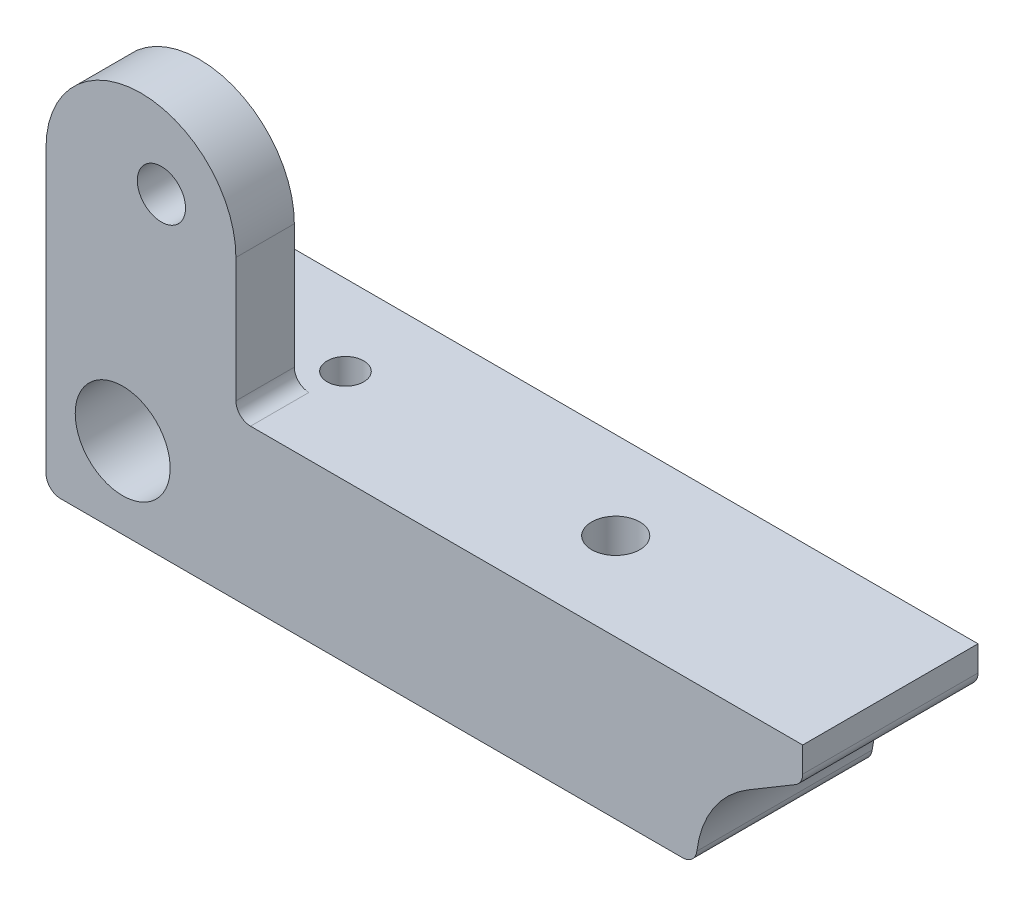
ISO-10303-21;
HEADER;
FILE_DESCRIPTION(('STEP AP214'),'2;1');
FILE_NAME('part.step','',(''),(''),'','','');
FILE_SCHEMA(('AUTOMOTIVE_DESIGN { 1 0 10303 214 1 1 1 1 }'));
ENDSEC;
DATA;
#1=APPLICATION_CONTEXT('core data for automotive mechanical design processes');
#2=APPLICATION_PROTOCOL_DEFINITION('international standard','automotive_design',2000,#1);
#3=PRODUCT_CONTEXT('',#1,'mechanical');
#4=PRODUCT('Part','Part','',(#3));
#5=PRODUCT_RELATED_PRODUCT_CATEGORY('part','',(#4));
#6=PRODUCT_DEFINITION_FORMATION('','',#4);
#7=PRODUCT_DEFINITION_CONTEXT('part definition',#1,'design');
#8=PRODUCT_DEFINITION('design','',#6,#7);
#9=PRODUCT_DEFINITION_SHAPE('','',#8);
#10=(LENGTH_UNIT() NAMED_UNIT(*) SI_UNIT(.MILLI.,.METRE.));
#11=(NAMED_UNIT(*) PLANE_ANGLE_UNIT() SI_UNIT($,.RADIAN.));
#12=(NAMED_UNIT(*) SI_UNIT($,.STERADIAN.) SOLID_ANGLE_UNIT());
#13=UNCERTAINTY_MEASURE_WITH_UNIT(LENGTH_MEASURE(1.E-05),#10,'distance_accuracy_value','');
#14=(GEOMETRIC_REPRESENTATION_CONTEXT(3) GLOBAL_UNCERTAINTY_ASSIGNED_CONTEXT((#13)) GLOBAL_UNIT_ASSIGNED_CONTEXT((#10,
#11,#12)) REPRESENTATION_CONTEXT('',''));
#15=CARTESIAN_POINT('',(0.,0.,0.));
#16=DIRECTION('',(0.,0.,1.));
#17=DIRECTION('',(1.,0.,0.));
#18=AXIS2_PLACEMENT_3D('',#15,#16,#17);
#19=CARTESIAN_POINT('',(-20.65,0.150000000000002,12.));
#20=DIRECTION('',(0.,0.,-1.));
#21=DIRECTION('',(-1.,0.,0.));
#22=AXIS2_PLACEMENT_3D('',#19,#20,#21);
#23=CYLINDRICAL_SURFACE('',#22,3.25);
#24=CARTESIAN_POINT('',(-20.65,0.150000000000002,12.));
#25=DIRECTION('',(0.,0.,-1.));
#26=DIRECTION('',(-1.,0.,0.));
#27=AXIS2_PLACEMENT_3D('',#24,#25,#26);
#28=CIRCLE('',#27,3.25);
#29=CARTESIAN_POINT('',(-23.9,0.150000000000002,12.));
#30=VERTEX_POINT('',#29);
#31=EDGE_CURVE('E168',#30,#30,#28,.T.);
#32=ORIENTED_EDGE('',*,*,#31,.F.);
#33=EDGE_LOOP('',(#32));
#34=FACE_BOUND('',#33,.T.);
#35=CARTESIAN_POINT('',(-20.65,0.150000000000002,1.05));
#36=DIRECTION('',(0.,0.,-1.));
#37=DIRECTION('',(-1.,0.,0.));
#38=AXIS2_PLACEMENT_3D('',#35,#36,#37);
#39=CIRCLE('',#38,3.25);
#40=CARTESIAN_POINT('',(-23.9,0.150000000000002,1.05));
#41=VERTEX_POINT('',#40);
#42=EDGE_CURVE('E38',#41,#41,#39,.F.);
#43=ORIENTED_EDGE('',*,*,#42,.F.);
#44=EDGE_LOOP('',(#43));
#45=FACE_BOUND('',#44,.T.);
#46=ADVANCED_FACE('F34',(#34,#45),#23,.F.);
#47=CARTESIAN_POINT('',(25.9,5.4,12.));
#48=DIRECTION('',(-1.,0.,0.));
#49=DIRECTION('',(0.,0.,1.));
#50=AXIS2_PLACEMENT_3D('',#47,#48,#49);
#51=PLANE('',#50);
#52=DIRECTION('',(0.,1.,0.));
#53=VECTOR('',#52,1.);
#54=CARTESIAN_POINT('',(25.9,5.4,12.));
#55=LINE('',#54,#53);
#56=CARTESIAN_POINT('',(25.9,3.66790298473761,12.));
#57=VERTEX_POINT('',#56);
#58=CARTESIAN_POINT('',(25.9,5.4,12.));
#59=VERTEX_POINT('',#58);
#60=EDGE_CURVE('E189',#57,#59,#55,.T.);
#61=ORIENTED_EDGE('',*,*,#60,.F.);
#62=DIRECTION('',(0.,0.,-1.));
#63=VECTOR('',#62,1.);
#64=CARTESIAN_POINT('',(25.9,3.66790298473761,12.));
#65=LINE('',#64,#63);
#66=CARTESIAN_POINT('',(25.9,3.66790298473761,0.));
#67=VERTEX_POINT('',#66);
#68=EDGE_CURVE('E212',#57,#67,#65,.T.);
#69=ORIENTED_EDGE('',*,*,#68,.T.);
#70=DIRECTION('',(0.,1.,0.));
#71=VECTOR('',#70,1.);
#72=CARTESIAN_POINT('',(25.9,5.4,0.));
#73=LINE('',#72,#71);
#74=CARTESIAN_POINT('',(25.9,5.4,0.));
#75=VERTEX_POINT('',#74);
#76=EDGE_CURVE('E186',#67,#75,#73,.T.);
#77=ORIENTED_EDGE('',*,*,#76,.T.);
#78=DIRECTION('',(0.,0.,-1.));
#79=VECTOR('',#78,1.);
#80=CARTESIAN_POINT('',(25.9,5.4,12.));
#81=LINE('',#80,#79);
#82=EDGE_CURVE('E200',#59,#75,#81,.T.);
#83=ORIENTED_EDGE('',*,*,#82,.F.);
#84=EDGE_LOOP('',(#61,#69,#77,#83));
#85=FACE_BOUND('',#84,.T.);
#86=ADVANCED_FACE('F265',(#85),#51,.F.);
#87=CARTESIAN_POINT('',(-25.9,5.4,12.));
#88=DIRECTION('',(0.,-1.,0.));
#89=DIRECTION('',(0.,0.,-1.));
#90=AXIS2_PLACEMENT_3D('',#87,#88,#89);
#91=PLANE('',#90);
#92=CARTESIAN_POINT('',(-11.9,5.4,5.5));
#93=DIRECTION('',(0.,1.,0.));
#94=DIRECTION('',(0.,0.,1.));
#95=AXIS2_PLACEMENT_3D('',#92,#93,#94);
#96=CIRCLE('',#95,1.25);
#97=CARTESIAN_POINT('',(-11.9,5.4,6.75));
#98=VERTEX_POINT('',#97);
#99=EDGE_CURVE('E344',#98,#98,#96,.T.);
#100=ORIENTED_EDGE('',*,*,#99,.F.);
#101=EDGE_LOOP('',(#100));
#102=FACE_BOUND('',#101,.T.);
#103=CARTESIAN_POINT('',(7.09999999999999,5.4,6.));
#104=DIRECTION('',(0.,1.,0.));
#105=DIRECTION('',(0.,0.,1.));
#106=AXIS2_PLACEMENT_3D('',#103,#104,#105);
#107=CIRCLE('',#106,1.65);
#108=CARTESIAN_POINT('',(7.09999999999999,5.4,7.65));
#109=VERTEX_POINT('',#108);
#110=EDGE_CURVE('E347',#109,#109,#107,.T.);
#111=ORIENTED_EDGE('',*,*,#110,.F.);
#112=EDGE_LOOP('',(#111));
#113=FACE_BOUND('',#112,.T.);
#114=DIRECTION('',(1.,0.,0.));
#115=VECTOR('',#114,1.);
#116=CARTESIAN_POINT('',(-25.9,5.4,8.));
#117=LINE('',#116,#115);
#118=CARTESIAN_POINT('',(-24.9,5.4,8.));
#119=VERTEX_POINT('',#118);
#120=CARTESIAN_POINT('',(-11.9,5.4,8.));
#121=VERTEX_POINT('',#120);
#122=EDGE_CURVE('E177',#119,#121,#117,.T.);
#123=ORIENTED_EDGE('',*,*,#122,.T.);
#124=DIRECTION('',(0.,0.,1.));
#125=VECTOR('',#124,1.);
#126=CARTESIAN_POINT('',(-11.9,5.4,12.));
#127=LINE('',#126,#125);
#128=CARTESIAN_POINT('',(-11.9,5.4,12.));
#129=VERTEX_POINT('',#128);
#130=EDGE_CURVE('E238',#121,#129,#127,.T.);
#131=ORIENTED_EDGE('',*,*,#130,.T.);
#132=DIRECTION('',(-1.,0.,0.));
#133=VECTOR('',#132,1.);
#134=CARTESIAN_POINT('',(-25.9,5.4,12.));
#135=LINE('',#134,#133);
#136=EDGE_CURVE('E191',#59,#129,#135,.T.);
#137=ORIENTED_EDGE('',*,*,#136,.F.);
#138=ORIENTED_EDGE('',*,*,#82,.T.);
#139=DIRECTION('',(-1.,0.,0.));
#140=VECTOR('',#139,1.);
#141=CARTESIAN_POINT('',(-25.9,5.4,0.));
#142=LINE('',#141,#140);
#143=CARTESIAN_POINT('',(-24.9,5.4,0.));
#144=VERTEX_POINT('',#143);
#145=EDGE_CURVE('E202',#75,#144,#142,.T.);
#146=ORIENTED_EDGE('',*,*,#145,.T.);
#147=DIRECTION('',(0.,0.,-1.));
#148=VECTOR('',#147,1.);
#149=CARTESIAN_POINT('',(-24.9,5.4,12.));
#150=LINE('',#149,#148);
#151=EDGE_CURVE('E236',#144,#119,#150,.F.);
#152=ORIENTED_EDGE('',*,*,#151,.T.);
#153=EDGE_LOOP('',(#123,#131,#137,#138,#146,#152));
#154=FACE_BOUND('',#153,.T.);
#155=ADVANCED_FACE('F260',(#102,#113,#154),#91,.F.);
#156=CARTESIAN_POINT('',(-25.9,5.4,12.));
#157=DIRECTION('',(1.,0.,0.));
#158=DIRECTION('',(0.,0.,-1.));
#159=AXIS2_PLACEMENT_3D('',#156,#157,#158);
#160=PLANE('',#159);
#161=DIRECTION('',(0.,-1.,0.));
#162=VECTOR('',#161,1.);
#163=CARTESIAN_POINT('',(-25.9,14.9,8.));
#164=LINE('',#163,#162);
#165=CARTESIAN_POINT('',(-25.9,14.9,8.));
#166=VERTEX_POINT('',#165);
#167=CARTESIAN_POINT('',(-25.9,4.4,8.));
#168=VERTEX_POINT('',#167);
#169=EDGE_CURVE('E50',#166,#168,#164,.T.);
#170=ORIENTED_EDGE('',*,*,#169,.T.);
#171=DIRECTION('',(0.,0.,-1.));
#172=VECTOR('',#171,1.);
#173=CARTESIAN_POINT('',(-25.9,4.4,12.));
#174=LINE('',#173,#172);
#175=CARTESIAN_POINT('',(-25.9,4.4,0.));
#176=VERTEX_POINT('',#175);
#177=EDGE_CURVE('E244',#168,#176,#174,.T.);
#178=ORIENTED_EDGE('',*,*,#177,.T.);
#179=DIRECTION('',(0.,-1.,0.));
#180=VECTOR('',#179,1.);
#181=CARTESIAN_POINT('',(-25.9,5.4,0.));
#182=LINE('',#181,#180);
#183=CARTESIAN_POINT('',(-25.9,-4.39999999999999,0.));
#184=VERTEX_POINT('',#183);
#185=EDGE_CURVE('E205',#176,#184,#182,.T.);
#186=ORIENTED_EDGE('',*,*,#185,.T.);
#187=DIRECTION('',(0.,0.,-1.));
#188=VECTOR('',#187,1.);
#189=CARTESIAN_POINT('',(-25.9,-4.4,12.));
#190=LINE('',#189,#188);
#191=CARTESIAN_POINT('',(-25.9,-4.39999999999999,12.));
#192=VERTEX_POINT('',#191);
#193=EDGE_CURVE('E242',#184,#192,#190,.F.);
#194=ORIENTED_EDGE('',*,*,#193,.T.);
#195=DIRECTION('',(0.,-1.,0.));
#196=VECTOR('',#195,1.);
#197=CARTESIAN_POINT('',(-25.9,5.4,12.));
#198=LINE('',#197,#196);
#199=CARTESIAN_POINT('',(-25.9,14.9,12.));
#200=VERTEX_POINT('',#199);
#201=EDGE_CURVE('E195',#200,#192,#198,.T.);
#202=ORIENTED_EDGE('',*,*,#201,.F.);
#203=DIRECTION('',(0.,0.,1.));
#204=VECTOR('',#203,1.);
#205=CARTESIAN_POINT('',(-25.9,14.9,8.));
#206=LINE('',#205,#204);
#207=EDGE_CURVE('E183',#166,#200,#206,.T.);
#208=ORIENTED_EDGE('',*,*,#207,.F.);
#209=EDGE_LOOP('',(#170,#178,#186,#194,#202,#208));
#210=FACE_BOUND('',#209,.T.);
#211=ADVANCED_FACE('F333',(#210),#160,.F.);
#212=CARTESIAN_POINT('',(-25.9,-5.4,12.));
#213=DIRECTION('',(0.,1.,0.));
#214=DIRECTION('',(0.,0.,1.));
#215=AXIS2_PLACEMENT_3D('',#212,#213,#214);
#216=PLANE('',#215);
#217=CARTESIAN_POINT('',(-11.9,-5.4,5.5));
#218=DIRECTION('',(0.,1.,0.));
#219=DIRECTION('',(0.,0.,1.));
#220=AXIS2_PLACEMENT_3D('',#217,#218,#219);
#221=CIRCLE('',#220,1.25);
#222=CARTESIAN_POINT('',(-11.9,-5.4,6.75));
#223=VERTEX_POINT('',#222);
#224=EDGE_CURVE('E350',#223,#223,#221,.T.);
#225=ORIENTED_EDGE('',*,*,#224,.T.);
#226=EDGE_LOOP('',(#225));
#227=FACE_BOUND('',#226,.T.);
#228=CARTESIAN_POINT('',(7.09999999999999,-5.4,6.));
#229=DIRECTION('',(0.,1.,0.));
#230=DIRECTION('',(0.,0.,1.));
#231=AXIS2_PLACEMENT_3D('',#228,#229,#230);
#232=CIRCLE('',#231,1.65);
#233=CARTESIAN_POINT('',(7.09999999999999,-5.4,7.65));
#234=VERTEX_POINT('',#233);
#235=EDGE_CURVE('E349',#234,#234,#232,.T.);
#236=ORIENTED_EDGE('',*,*,#235,.T.);
#237=EDGE_LOOP('',(#236));
#238=FACE_BOUND('',#237,.T.);
#239=DIRECTION('',(1.,0.,0.));
#240=VECTOR('',#239,1.);
#241=CARTESIAN_POINT('',(-25.9,-5.4,0.));
#242=LINE('',#241,#240);
#243=CARTESIAN_POINT('',(-24.9,-5.4,0.));
#244=VERTEX_POINT('',#243);
#245=CARTESIAN_POINT('',(17.6604611779542,-5.4,0.));
#246=VERTEX_POINT('',#245);
#247=EDGE_CURVE('E192',#244,#246,#242,.T.);
#248=ORIENTED_EDGE('',*,*,#247,.T.);
#249=DIRECTION('',(0.,0.,-1.));
#250=VECTOR('',#249,1.);
#251=CARTESIAN_POINT('',(17.6604611779542,-5.4,12.));
#252=LINE('',#251,#250);
#253=CARTESIAN_POINT('',(17.6604611779542,-5.4,12.));
#254=VERTEX_POINT('',#253);
#255=EDGE_CURVE('E234',#246,#254,#252,.F.);
#256=ORIENTED_EDGE('',*,*,#255,.T.);
#257=DIRECTION('',(1.,0.,0.));
#258=VECTOR('',#257,1.);
#259=CARTESIAN_POINT('',(-25.9,-5.4,12.));
#260=LINE('',#259,#258);
#261=CARTESIAN_POINT('',(-24.9,-5.4,12.));
#262=VERTEX_POINT('',#261);
#263=EDGE_CURVE('E198',#262,#254,#260,.T.);
#264=ORIENTED_EDGE('',*,*,#263,.F.);
#265=DIRECTION('',(0.,0.,-1.));
#266=VECTOR('',#265,1.);
#267=CARTESIAN_POINT('',(-24.9,-5.4,12.));
#268=LINE('',#267,#266);
#269=EDGE_CURVE('E231',#262,#244,#268,.T.);
#270=ORIENTED_EDGE('',*,*,#269,.T.);
#271=EDGE_LOOP('',(#248,#256,#264,#270));
#272=FACE_BOUND('',#271,.T.);
#273=ADVANCED_FACE('F289',(#227,#238,#272),#216,.F.);
#274=CARTESIAN_POINT('',(0.,0.,12.));
#275=DIRECTION('',(0.,0.,1.));
#276=DIRECTION('',(1.,0.,0.));
#277=AXIS2_PLACEMENT_3D('',#274,#275,#276);
#278=PLANE('',#277);
#279=CARTESIAN_POINT('',(-18.,16.1,12.));
#280=DIRECTION('',(0.,0.,1.));
#281=DIRECTION('',(1.,0.,0.));
#282=AXIS2_PLACEMENT_3D('',#279,#280,#281);
#283=CIRCLE('',#282,1.64999999999999);
#284=CARTESIAN_POINT('',(-16.35,16.1,12.));
#285=VERTEX_POINT('',#284);
#286=EDGE_CURVE('E396',#285,#285,#283,.T.);
#287=ORIENTED_EDGE('',*,*,#286,.F.);
#288=EDGE_LOOP('',(#287));
#289=FACE_BOUND('',#288,.T.);
#290=ORIENTED_EDGE('',*,*,#31,.T.);
#291=EDGE_LOOP('',(#290));
#292=FACE_BOUND('',#291,.T.);
#293=DIRECTION('',(0.858823529411765,0.51227155428417,0.));
#294=VECTOR('',#293,1.);
#295=CARTESIAN_POINT('',(22.1604176537255,0.869411764705884,12.));
#296=LINE('',#295,#294);
#297=CARTESIAN_POINT('',(22.1604176537255,0.869411764705884,12.));
#298=VERTEX_POINT('',#297);
#299=CARTESIAN_POINT('',(25.4122715542842,2.80907945532585,12.));
#300=VERTEX_POINT('',#299);
#301=EDGE_CURVE('E141',#298,#300,#296,.T.);
#302=ORIENTED_EDGE('',*,*,#301,.T.);
#303=CARTESIAN_POINT('',(24.9,3.66790298473761,12.));
#304=DIRECTION('',(0.,0.,1.));
#305=DIRECTION('',(1.,0.,0.));
#306=AXIS2_PLACEMENT_3D('',#303,#304,#305);
#307=CIRCLE('',#306,1.);
#308=EDGE_CURVE('E227',#300,#57,#307,.T.);
#309=ORIENTED_EDGE('',*,*,#308,.T.);
#310=ORIENTED_EDGE('',*,*,#60,.T.);
#311=ORIENTED_EDGE('',*,*,#136,.T.);
#312=CARTESIAN_POINT('',(-11.9,6.4,12.));
#313=DIRECTION('',(0.,0.,1.));
#314=DIRECTION('',(1.,0.,0.));
#315=AXIS2_PLACEMENT_3D('',#312,#313,#314);
#316=CIRCLE('',#315,1.);
#317=CARTESIAN_POINT('',(-12.9,6.4,12.));
#318=VERTEX_POINT('',#317);
#319=EDGE_CURVE('E246',#129,#318,#316,.F.);
#320=ORIENTED_EDGE('',*,*,#319,.T.);
#321=DIRECTION('',(0.,1.,0.));
#322=VECTOR('',#321,1.);
#323=CARTESIAN_POINT('',(-12.9,5.4,12.));
#324=LINE('',#323,#322);
#325=CARTESIAN_POINT('',(-12.9,14.9,12.));
#326=VERTEX_POINT('',#325);
#327=EDGE_CURVE('E159',#318,#326,#324,.T.);
#328=ORIENTED_EDGE('',*,*,#327,.T.);
#329=CARTESIAN_POINT('',(-19.4,14.9,12.));
#330=DIRECTION('',(0.,0.,1.));
#331=DIRECTION('',(1.,0.,0.));
#332=AXIS2_PLACEMENT_3D('',#329,#330,#331);
#333=CIRCLE('',#332,6.5);
#334=EDGE_CURVE('E173',#326,#200,#333,.T.);
#335=ORIENTED_EDGE('',*,*,#334,.T.);
#336=ORIENTED_EDGE('',*,*,#201,.T.);
#337=CARTESIAN_POINT('',(-24.9,-4.4,12.));
#338=DIRECTION('',(0.,0.,1.));
#339=DIRECTION('',(1.,0.,0.));
#340=AXIS2_PLACEMENT_3D('',#337,#338,#339);
#341=CIRCLE('',#340,1.);
#342=EDGE_CURVE('E224',#192,#262,#341,.T.);
#343=ORIENTED_EDGE('',*,*,#342,.T.);
#344=ORIENTED_EDGE('',*,*,#263,.T.);
#345=CARTESIAN_POINT('',(17.6604611779542,-4.4,12.));
#346=DIRECTION('',(0.,0.,1.));
#347=DIRECTION('',(1.,0.,0.));
#348=AXIS2_PLACEMENT_3D('',#345,#346,#347);
#349=CIRCLE('',#348,1.);
#350=CARTESIAN_POINT('',(18.6531766986826,-4.52048192771084,12.));
#351=VERTEX_POINT('',#350);
#352=EDGE_CURVE('E145',#254,#351,#349,.T.);
#353=ORIENTED_EDGE('',*,*,#352,.T.);
#354=CARTESIAN_POINT('',(25.9,-5.4,12.));
#355=DIRECTION('',(0.,0.,-1.));
#356=DIRECTION('',(1.,0.,0.));
#357=AXIS2_PLACEMENT_3D('',#354,#355,#356);
#358=CIRCLE('',#357,7.3);
#359=EDGE_CURVE('E137',#351,#298,#358,.T.);
#360=ORIENTED_EDGE('',*,*,#359,.T.);
#361=EDGE_LOOP('',(#302,#309,#310,#311,#320,#328,#335,#336,#343,#344,#353,#360));
#362=FACE_BOUND('',#361,.T.);
#363=ADVANCED_FACE('F139',(#289,#292,#362),#278,.T.);
#364=CARTESIAN_POINT('',(0.,0.,0.));
#365=DIRECTION('',(0.,0.,1.));
#366=DIRECTION('',(1.,0.,0.));
#367=AXIS2_PLACEMENT_3D('',#364,#365,#366);
#368=PLANE('',#367);
#369=CARTESIAN_POINT('',(-20.65,0.150000000000002,0.));
#370=DIRECTION('',(0.,0.,-1.));
#371=DIRECTION('',(-1.,0.,0.));
#372=AXIS2_PLACEMENT_3D('',#369,#370,#371);
#373=CIRCLE('',#372,4.);
#374=CARTESIAN_POINT('',(-24.65,0.150000000000002,0.));
#375=VERTEX_POINT('',#374);
#376=EDGE_CURVE('E353',#375,#375,#373,.T.);
#377=ORIENTED_EDGE('',*,*,#376,.F.);
#378=EDGE_LOOP('',(#377));
#379=FACE_BOUND('',#378,.T.);
#380=ORIENTED_EDGE('',*,*,#76,.F.);
#381=CARTESIAN_POINT('',(24.9,3.66790298473761,0.));
#382=DIRECTION('',(0.,0.,1.));
#383=DIRECTION('',(1.,0.,0.));
#384=AXIS2_PLACEMENT_3D('',#381,#382,#383);
#385=CIRCLE('',#384,1.);
#386=CARTESIAN_POINT('',(25.4122715542842,2.80907945532585,0.));
#387=VERTEX_POINT('',#386);
#388=EDGE_CURVE('E221',#67,#387,#385,.F.);
#389=ORIENTED_EDGE('',*,*,#388,.T.);
#390=DIRECTION('',(0.858823529411765,0.51227155428417,0.));
#391=VECTOR('',#390,1.);
#392=CARTESIAN_POINT('',(22.1604176537255,0.869411764705884,0.));
#393=LINE('',#392,#391);
#394=CARTESIAN_POINT('',(22.1604176537255,0.869411764705884,0.));
#395=VERTEX_POINT('',#394);
#396=EDGE_CURVE('E149',#395,#387,#393,.T.);
#397=ORIENTED_EDGE('',*,*,#396,.F.);
#398=CARTESIAN_POINT('',(25.9,-5.4,0.));
#399=DIRECTION('',(0.,0.,-1.));
#400=DIRECTION('',(1.,0.,0.));
#401=AXIS2_PLACEMENT_3D('',#398,#399,#400);
#402=CIRCLE('',#401,7.3);
#403=CARTESIAN_POINT('',(18.6531766986826,-4.52048192771084,0.));
#404=VERTEX_POINT('',#403);
#405=EDGE_CURVE('E155',#404,#395,#402,.T.);
#406=ORIENTED_EDGE('',*,*,#405,.F.);
#407=CARTESIAN_POINT('',(17.6604611779542,-4.4,0.));
#408=DIRECTION('',(0.,0.,1.));
#409=DIRECTION('',(1.,0.,0.));
#410=AXIS2_PLACEMENT_3D('',#407,#408,#409);
#411=CIRCLE('',#410,1.);
#412=EDGE_CURVE('E219',#404,#246,#411,.F.);
#413=ORIENTED_EDGE('',*,*,#412,.T.);
#414=ORIENTED_EDGE('',*,*,#247,.F.);
#415=CARTESIAN_POINT('',(-24.9,-4.4,0.));
#416=DIRECTION('',(0.,0.,1.));
#417=DIRECTION('',(1.,0.,0.));
#418=AXIS2_PLACEMENT_3D('',#415,#416,#417);
#419=CIRCLE('',#418,1.);
#420=EDGE_CURVE('E215',#244,#184,#419,.F.);
#421=ORIENTED_EDGE('',*,*,#420,.T.);
#422=ORIENTED_EDGE('',*,*,#185,.F.);
#423=CARTESIAN_POINT('',(-24.9,4.4,0.));
#424=DIRECTION('',(0.,0.,1.));
#425=DIRECTION('',(1.,0.,0.));
#426=AXIS2_PLACEMENT_3D('',#423,#424,#425);
#427=CIRCLE('',#426,1.);
#428=EDGE_CURVE('E217',#176,#144,#427,.F.);
#429=ORIENTED_EDGE('',*,*,#428,.T.);
#430=ORIENTED_EDGE('',*,*,#145,.F.);
#431=EDGE_LOOP('',(#380,#389,#397,#406,#413,#414,#421,#422,#429,#430));
#432=FACE_BOUND('',#431,.T.);
#433=ADVANCED_FACE('F270',(#379,#432),#368,.F.);
#434=CARTESIAN_POINT('',(-12.9,5.4,8.));
#435=DIRECTION('',(1.,0.,0.));
#436=DIRECTION('',(0.,1.,0.));
#437=AXIS2_PLACEMENT_3D('',#434,#435,#436);
#438=PLANE('',#437);
#439=ORIENTED_EDGE('',*,*,#327,.F.);
#440=DIRECTION('',(0.,0.,1.));
#441=VECTOR('',#440,1.);
#442=CARTESIAN_POINT('',(-12.9,6.4,8.));
#443=LINE('',#442,#441);
#444=CARTESIAN_POINT('',(-12.9,6.4,8.));
#445=VERTEX_POINT('',#444);
#446=EDGE_CURVE('E57',#318,#445,#443,.F.);
#447=ORIENTED_EDGE('',*,*,#446,.T.);
#448=DIRECTION('',(0.,1.,0.));
#449=VECTOR('',#448,1.);
#450=CARTESIAN_POINT('',(-12.9,5.4,8.));
#451=LINE('',#450,#449);
#452=CARTESIAN_POINT('',(-12.9,14.9,8.));
#453=VERTEX_POINT('',#452);
#454=EDGE_CURVE('E170',#445,#453,#451,.T.);
#455=ORIENTED_EDGE('',*,*,#454,.T.);
#456=DIRECTION('',(0.,0.,1.));
#457=VECTOR('',#456,1.);
#458=CARTESIAN_POINT('',(-12.9,14.9,8.));
#459=LINE('',#458,#457);
#460=EDGE_CURVE('E179',#453,#326,#459,.T.);
#461=ORIENTED_EDGE('',*,*,#460,.T.);
#462=EDGE_LOOP('',(#439,#447,#455,#461));
#463=FACE_BOUND('',#462,.T.);
#464=ADVANCED_FACE('F281',(#463),#438,.T.);
#465=CARTESIAN_POINT('',(-19.4,14.9,8.));
#466=DIRECTION('',(0.,0.,1.));
#467=DIRECTION('',(1.,0.,0.));
#468=AXIS2_PLACEMENT_3D('',#465,#466,#467);
#469=CYLINDRICAL_SURFACE('',#468,6.5);
#470=ORIENTED_EDGE('',*,*,#334,.F.);
#471=ORIENTED_EDGE('',*,*,#460,.F.);
#472=CARTESIAN_POINT('',(-19.4,14.9,8.));
#473=DIRECTION('',(0.,0.,1.));
#474=DIRECTION('',(1.,0.,0.));
#475=AXIS2_PLACEMENT_3D('',#472,#473,#474);
#476=CIRCLE('',#475,6.5);
#477=EDGE_CURVE('E172',#453,#166,#476,.T.);
#478=ORIENTED_EDGE('',*,*,#477,.T.);
#479=ORIENTED_EDGE('',*,*,#207,.T.);
#480=EDGE_LOOP('',(#470,#471,#478,#479));
#481=FACE_BOUND('',#480,.T.);
#482=ADVANCED_FACE('F280',(#481),#469,.T.);
#483=CARTESIAN_POINT('',(-19.4,14.9,8.));
#484=DIRECTION('',(0.,0.,1.));
#485=DIRECTION('',(1.,0.,0.));
#486=AXIS2_PLACEMENT_3D('',#483,#484,#485);
#487=PLANE('',#486);
#488=CARTESIAN_POINT('',(-18.,16.1,8.));
#489=DIRECTION('',(0.,0.,1.));
#490=DIRECTION('',(1.,0.,0.));
#491=AXIS2_PLACEMENT_3D('',#488,#489,#490);
#492=CIRCLE('',#491,1.64999999999999);
#493=CARTESIAN_POINT('',(-16.35,16.1,8.));
#494=VERTEX_POINT('',#493);
#495=EDGE_CURVE('E393',#494,#494,#492,.T.);
#496=ORIENTED_EDGE('',*,*,#495,.T.);
#497=EDGE_LOOP('',(#496));
#498=FACE_BOUND('',#497,.T.);
#499=ORIENTED_EDGE('',*,*,#454,.F.);
#500=CARTESIAN_POINT('',(-11.9,6.4,8.));
#501=DIRECTION('',(0.,0.,1.));
#502=DIRECTION('',(1.,0.,0.));
#503=AXIS2_PLACEMENT_3D('',#500,#501,#502);
#504=CIRCLE('',#503,1.);
#505=EDGE_CURVE('E43',#445,#121,#504,.T.);
#506=ORIENTED_EDGE('',*,*,#505,.T.);
#507=ORIENTED_EDGE('',*,*,#122,.F.);
#508=CARTESIAN_POINT('',(-24.9,4.4,8.));
#509=DIRECTION('',(0.,0.,1.));
#510=DIRECTION('',(1.,0.,0.));
#511=AXIS2_PLACEMENT_3D('',#508,#509,#510);
#512=CIRCLE('',#511,1.);
#513=EDGE_CURVE('E11',#119,#168,#512,.T.);
#514=ORIENTED_EDGE('',*,*,#513,.T.);
#515=ORIENTED_EDGE('',*,*,#169,.F.);
#516=ORIENTED_EDGE('',*,*,#477,.F.);
#517=EDGE_LOOP('',(#499,#506,#507,#514,#515,#516));
#518=FACE_BOUND('',#517,.T.);
#519=ADVANCED_FACE('F253',(#498,#518),#487,.F.);
#520=CARTESIAN_POINT('',(25.9,-5.4,12.));
#521=DIRECTION('',(0.,0.,-1.));
#522=DIRECTION('',(-1.,0.,0.));
#523=AXIS2_PLACEMENT_3D('',#520,#521,#522);
#524=CYLINDRICAL_SURFACE('',#523,7.3);
#525=ORIENTED_EDGE('',*,*,#359,.F.);
#526=DIRECTION('',(0.,0.,-1.));
#527=VECTOR('',#526,1.);
#528=CARTESIAN_POINT('',(18.6531766986826,-4.52048192771084,12.));
#529=LINE('',#528,#527);
#530=EDGE_CURVE('E229',#351,#404,#529,.T.);
#531=ORIENTED_EDGE('',*,*,#530,.T.);
#532=ORIENTED_EDGE('',*,*,#405,.T.);
#533=DIRECTION('',(0.,0.,-1.));
#534=VECTOR('',#533,1.);
#535=CARTESIAN_POINT('',(22.1604176537255,0.869411764705884,12.));
#536=LINE('',#535,#534);
#537=EDGE_CURVE('E152',#298,#395,#536,.T.);
#538=ORIENTED_EDGE('',*,*,#537,.F.);
#539=EDGE_LOOP('',(#525,#531,#532,#538));
#540=FACE_BOUND('',#539,.T.);
#541=ADVANCED_FACE('F153',(#540),#524,.F.);
#542=CARTESIAN_POINT('',(22.1604176537255,0.869411764705884,12.));
#543=DIRECTION('',(-0.51227155428417,0.858823529411765,0.));
#544=DIRECTION('',(-0.858823529411765,-0.51227155428417,0.));
#545=AXIS2_PLACEMENT_3D('',#542,#543,#544);
#546=PLANE('',#545);
#547=ORIENTED_EDGE('',*,*,#396,.T.);
#548=DIRECTION('',(0.,0.,-1.));
#549=VECTOR('',#548,1.);
#550=CARTESIAN_POINT('',(25.4122715542842,2.80907945532585,12.));
#551=LINE('',#550,#549);
#552=EDGE_CURVE('E163',#387,#300,#551,.F.);
#553=ORIENTED_EDGE('',*,*,#552,.T.);
#554=ORIENTED_EDGE('',*,*,#301,.F.);
#555=ORIENTED_EDGE('',*,*,#537,.T.);
#556=EDGE_LOOP('',(#547,#553,#554,#555));
#557=FACE_BOUND('',#556,.T.);
#558=ADVANCED_FACE('F161',(#557),#546,.F.);
#559=CARTESIAN_POINT('',(24.9,3.66790298473761,12.));
#560=DIRECTION('',(0.,0.,-1.));
#561=DIRECTION('',(-1.,0.,0.));
#562=AXIS2_PLACEMENT_3D('',#559,#560,#561);
#563=CYLINDRICAL_SURFACE('',#562,1.);
#564=ORIENTED_EDGE('',*,*,#308,.F.);
#565=ORIENTED_EDGE('',*,*,#552,.F.);
#566=ORIENTED_EDGE('',*,*,#388,.F.);
#567=ORIENTED_EDGE('',*,*,#68,.F.);
#568=EDGE_LOOP('',(#564,#565,#566,#567));
#569=FACE_BOUND('',#568,.T.);
#570=ADVANCED_FACE('F268',(#569),#563,.T.);
#571=CARTESIAN_POINT('',(17.6604611779542,-4.4,12.));
#572=DIRECTION('',(0.,0.,-1.));
#573=DIRECTION('',(-1.,0.,0.));
#574=AXIS2_PLACEMENT_3D('',#571,#572,#573);
#575=CYLINDRICAL_SURFACE('',#574,1.);
#576=ORIENTED_EDGE('',*,*,#352,.F.);
#577=ORIENTED_EDGE('',*,*,#255,.F.);
#578=ORIENTED_EDGE('',*,*,#412,.F.);
#579=ORIENTED_EDGE('',*,*,#530,.F.);
#580=EDGE_LOOP('',(#576,#577,#578,#579));
#581=FACE_BOUND('',#580,.T.);
#582=ADVANCED_FACE('F292',(#581),#575,.T.);
#583=CARTESIAN_POINT('',(-11.9,6.4,12.));
#584=DIRECTION('',(0.,0.,1.));
#585=DIRECTION('',(1.,0.,0.));
#586=AXIS2_PLACEMENT_3D('',#583,#584,#585);
#587=CYLINDRICAL_SURFACE('',#586,1.);
#588=ORIENTED_EDGE('',*,*,#505,.F.);
#589=ORIENTED_EDGE('',*,*,#446,.F.);
#590=ORIENTED_EDGE('',*,*,#319,.F.);
#591=ORIENTED_EDGE('',*,*,#130,.F.);
#592=EDGE_LOOP('',(#588,#589,#590,#591));
#593=FACE_BOUND('',#592,.T.);
#594=ADVANCED_FACE('F257',(#593),#587,.F.);
#595=CARTESIAN_POINT('',(-24.9,4.4,12.));
#596=DIRECTION('',(0.,0.,-1.));
#597=DIRECTION('',(-1.,0.,0.));
#598=AXIS2_PLACEMENT_3D('',#595,#596,#597);
#599=CYLINDRICAL_SURFACE('',#598,1.);
#600=ORIENTED_EDGE('',*,*,#513,.F.);
#601=ORIENTED_EDGE('',*,*,#151,.F.);
#602=ORIENTED_EDGE('',*,*,#428,.F.);
#603=ORIENTED_EDGE('',*,*,#177,.F.);
#604=EDGE_LOOP('',(#600,#601,#602,#603));
#605=FACE_BOUND('',#604,.T.);
#606=ADVANCED_FACE('F275',(#605),#599,.T.);
#607=CARTESIAN_POINT('',(-24.9,-4.4,12.));
#608=DIRECTION('',(0.,0.,-1.));
#609=DIRECTION('',(-1.,0.,0.));
#610=AXIS2_PLACEMENT_3D('',#607,#608,#609);
#611=CYLINDRICAL_SURFACE('',#610,1.);
#612=ORIENTED_EDGE('',*,*,#342,.F.);
#613=ORIENTED_EDGE('',*,*,#193,.F.);
#614=ORIENTED_EDGE('',*,*,#420,.F.);
#615=ORIENTED_EDGE('',*,*,#269,.F.);
#616=EDGE_LOOP('',(#612,#613,#614,#615));
#617=FACE_BOUND('',#616,.T.);
#618=ADVANCED_FACE('F36',(#617),#611,.T.);
#619=CARTESIAN_POINT('',(-20.65,0.150000000000002,1.05));
#620=DIRECTION('',(0.,0.,-1.));
#621=DIRECTION('',(-1.,0.,0.));
#622=AXIS2_PLACEMENT_3D('',#619,#620,#621);
#623=PLANE('',#622);
#624=CARTESIAN_POINT('',(-20.65,0.150000000000002,1.05));
#625=DIRECTION('',(0.,0.,-1.));
#626=DIRECTION('',(-1.,0.,0.));
#627=AXIS2_PLACEMENT_3D('',#624,#625,#626);
#628=CIRCLE('',#627,4.);
#629=CARTESIAN_POINT('',(-24.65,0.150000000000002,1.05));
#630=VERTEX_POINT('',#629);
#631=EDGE_CURVE('E359',#630,#630,#628,.T.);
#632=ORIENTED_EDGE('',*,*,#631,.T.);
#633=EDGE_LOOP('',(#632));
#634=FACE_BOUND('',#633,.T.);
#635=ORIENTED_EDGE('',*,*,#42,.T.);
#636=EDGE_LOOP('',(#635));
#637=FACE_BOUND('',#636,.T.);
#638=ADVANCED_FACE('F368',(#634,#637),#623,.T.);
#639=CARTESIAN_POINT('',(-20.65,0.150000000000002,1.05));
#640=DIRECTION('',(0.,0.,-1.));
#641=DIRECTION('',(-1.,0.,0.));
#642=AXIS2_PLACEMENT_3D('',#639,#640,#641);
#643=CYLINDRICAL_SURFACE('',#642,4.);
#644=ORIENTED_EDGE('',*,*,#631,.F.);
#645=EDGE_LOOP('',(#644));
#646=FACE_BOUND('',#645,.T.);
#647=ORIENTED_EDGE('',*,*,#376,.T.);
#648=EDGE_LOOP('',(#647));
#649=FACE_BOUND('',#648,.T.);
#650=ADVANCED_FACE('F312',(#646,#649),#643,.F.);
#651=CARTESIAN_POINT('',(7.09999999999999,5.4,6.));
#652=DIRECTION('',(0.,1.,0.));
#653=DIRECTION('',(0.,0.,1.));
#654=AXIS2_PLACEMENT_3D('',#651,#652,#653);
#655=CYLINDRICAL_SURFACE('',#654,1.65);
#656=ORIENTED_EDGE('',*,*,#235,.F.);
#657=EDGE_LOOP('',(#656));
#658=FACE_BOUND('',#657,.T.);
#659=ORIENTED_EDGE('',*,*,#110,.T.);
#660=EDGE_LOOP('',(#659));
#661=FACE_BOUND('',#660,.T.);
#662=ADVANCED_FACE('F375',(#658,#661),#655,.F.);
#663=CARTESIAN_POINT('',(-11.9,-5.4,5.5));
#664=DIRECTION('',(0.,1.,0.));
#665=DIRECTION('',(0.,0.,1.));
#666=AXIS2_PLACEMENT_3D('',#663,#664,#665);
#667=CYLINDRICAL_SURFACE('',#666,1.25);
#668=CARTESIAN_POINT('',(-11.9,-5.4,6.75));
#669=CARTESIAN_POINT('',(-11.9,-5.2875,6.75));
#670=CARTESIAN_POINT('',(-11.9,-5.175,6.75));
#671=CARTESIAN_POINT('',(-11.9,-4.95,6.75));
#672=CARTESIAN_POINT('',(-11.9,-4.8375,6.75));
#673=CARTESIAN_POINT('',(-11.9,-4.6125,6.75));
#674=CARTESIAN_POINT('',(-11.9,-4.5,6.75));
#675=CARTESIAN_POINT('',(-11.9,-4.275,6.75));
#676=CARTESIAN_POINT('',(-11.9,-4.1625,6.75));
#677=CARTESIAN_POINT('',(-11.9,-3.9375,6.75));
#678=CARTESIAN_POINT('',(-11.9,-3.825,6.75));
#679=CARTESIAN_POINT('',(-11.9,-3.6,6.75));
#680=CARTESIAN_POINT('',(-11.9,-3.4875,6.75));
#681=CARTESIAN_POINT('',(-11.9,-3.2625,6.75));
#682=CARTESIAN_POINT('',(-11.9,-3.15,6.75));
#683=CARTESIAN_POINT('',(-11.9,-2.925,6.75));
#684=CARTESIAN_POINT('',(-11.9,-2.8125,6.75));
#685=CARTESIAN_POINT('',(-11.9,-2.5875,6.75));
#686=CARTESIAN_POINT('',(-11.9,-2.475,6.75));
#687=CARTESIAN_POINT('',(-11.9,-2.25,6.75));
#688=CARTESIAN_POINT('',(-11.9,-2.1375,6.75));
#689=CARTESIAN_POINT('',(-11.9,-1.9125,6.75));
#690=CARTESIAN_POINT('',(-11.9,-1.8,6.75));
#691=CARTESIAN_POINT('',(-11.9,-1.575,6.75));
#692=CARTESIAN_POINT('',(-11.9,-1.4625,6.75));
#693=CARTESIAN_POINT('',(-11.9,-1.2375,6.75));
#694=CARTESIAN_POINT('',(-11.9,-1.125,6.75));
#695=CARTESIAN_POINT('',(-11.9,-0.9,6.75));
#696=CARTESIAN_POINT('',(-11.9,-0.787499999999999,6.75));
#697=CARTESIAN_POINT('',(-11.9,-0.562499999999999,6.75));
#698=CARTESIAN_POINT('',(-11.9,-0.449999999999999,6.75));
#699=CARTESIAN_POINT('',(-11.9,-0.224999999999999,6.75));
#700=CARTESIAN_POINT('',(-11.9,-0.112499999999999,6.75));
#701=CARTESIAN_POINT('',(-11.9,0.112500000000001,6.75));
#702=CARTESIAN_POINT('',(-11.9,0.225000000000001,6.75));
#703=CARTESIAN_POINT('',(-11.9,0.450000000000001,6.75));
#704=CARTESIAN_POINT('',(-11.9,0.562500000000001,6.75));
#705=CARTESIAN_POINT('',(-11.9,0.787500000000001,6.75));
#706=CARTESIAN_POINT('',(-11.9,0.900000000000001,6.75));
#707=CARTESIAN_POINT('',(-11.9,1.125,6.75));
#708=CARTESIAN_POINT('',(-11.9,1.2375,6.75));
#709=CARTESIAN_POINT('',(-11.9,1.4625,6.75));
#710=CARTESIAN_POINT('',(-11.9,1.575,6.75));
#711=CARTESIAN_POINT('',(-11.9,1.8,6.75));
#712=CARTESIAN_POINT('',(-11.9,1.9125,6.75));
#713=CARTESIAN_POINT('',(-11.9,2.1375,6.75));
#714=CARTESIAN_POINT('',(-11.9,2.25,6.75));
#715=CARTESIAN_POINT('',(-11.9,2.475,6.75));
#716=CARTESIAN_POINT('',(-11.9,2.5875,6.75));
#717=CARTESIAN_POINT('',(-11.9,2.8125,6.75));
#718=CARTESIAN_POINT('',(-11.9,2.925,6.75));
#719=CARTESIAN_POINT('',(-11.9,3.15,6.75));
#720=CARTESIAN_POINT('',(-11.9,3.2625,6.75));
#721=CARTESIAN_POINT('',(-11.9,3.4875,6.75));
#722=CARTESIAN_POINT('',(-11.9,3.6,6.75));
#723=CARTESIAN_POINT('',(-11.9,3.825,6.75));
#724=CARTESIAN_POINT('',(-11.9,3.9375,6.75));
#725=CARTESIAN_POINT('',(-11.9,4.1625,6.75));
#726=CARTESIAN_POINT('',(-11.9,4.275,6.75));
#727=CARTESIAN_POINT('',(-11.9,4.5,6.75));
#728=CARTESIAN_POINT('',(-11.9,4.6125,6.75));
#729=CARTESIAN_POINT('',(-11.9,4.8375,6.75));
#730=CARTESIAN_POINT('',(-11.9,4.95,6.75));
#731=CARTESIAN_POINT('',(-11.9,5.175,6.75));
#732=CARTESIAN_POINT('',(-11.9,5.2875,6.75));
#733=CARTESIAN_POINT('',(-11.9,5.4,6.75));
#734=B_SPLINE_CURVE_WITH_KNOTS('',3,(#668,#669,#670,#671,#672,#673,#674,#675,#676,#677,#678,
#679,#680,#681,#682,#683,#684,#685,#686,#687,#688,#689,#690,#691,#692,#693,#694,#695,#696,#697,
#698,#699,#700,#701,#702,#703,#704,#705,#706,#707,#708,#709,#710,#711,#712,#713,#714,#715,#716,
#717,#718,#719,#720,#721,#722,#723,#724,#725,#726,#727,#728,#729,#730,#731,#732,#733),
.UNSPECIFIED.,.F.,.F.,(4,2,2,2,2,2,2,2,2,2,2,2,2,2,2,2,2,2,2,2,2,2,2,2,2,2,2,2,2,2,2,2,4),(0.,
0.337499999999999,0.674999999999999,1.0125,1.35,1.6875,2.025,2.3625,2.7,3.0375,3.375,3.7125,
4.05,4.3875,4.725,5.0625,5.4,5.7375,6.075,6.4125,6.75,7.0875,7.425,7.7625,8.1,8.4375,8.775,
9.1125,9.45,9.7875,10.125,10.4625,10.8),.UNSPECIFIED.);
#735=EDGE_CURVE('BSEAM380',#223,#98,#734,.T.);
#736=ORIENTED_EDGE('',*,*,#224,.F.);
#737=ORIENTED_EDGE('',*,*,#99,.T.);
#738=ORIENTED_EDGE('',*,*,#735,.T.);
#739=ORIENTED_EDGE('',*,*,#735,.F.);
#740=EDGE_LOOP('',(#736,#738,#737,#739));
#741=FACE_BOUND('',#740,.T.);
#742=ADVANCED_FACE('F380',(#741),#667,.F.);
#743=CARTESIAN_POINT('',(-18.,16.1,12.));
#744=DIRECTION('',(0.,0.,1.));
#745=DIRECTION('',(1.,0.,0.));
#746=AXIS2_PLACEMENT_3D('',#743,#744,#745);
#747=CYLINDRICAL_SURFACE('',#746,1.64999999999999);
#748=ORIENTED_EDGE('',*,*,#495,.F.);
#749=EDGE_LOOP('',(#748));
#750=FACE_BOUND('',#749,.T.);
#751=ORIENTED_EDGE('',*,*,#286,.T.);
#752=EDGE_LOOP('',(#751));
#753=FACE_BOUND('',#752,.T.);
#754=ADVANCED_FACE('F384',(#750,#753),#747,.F.);
#755=CLOSED_SHELL('',(#46,#86,#155,#211,#273,#363,#433,#464,#482,#519,#541,#558,#570,#582,#594,
#606,#618,#638,#650,#662,#742,#754));
#756=MANIFOLD_SOLID_BREP('B2',#755);
#757=ADVANCED_BREP_SHAPE_REPRESENTATION('',(#18,#756),#14);
#758=SHAPE_DEFINITION_REPRESENTATION(#9,#757);
ENDSEC;
END-ISO-10303-21;
